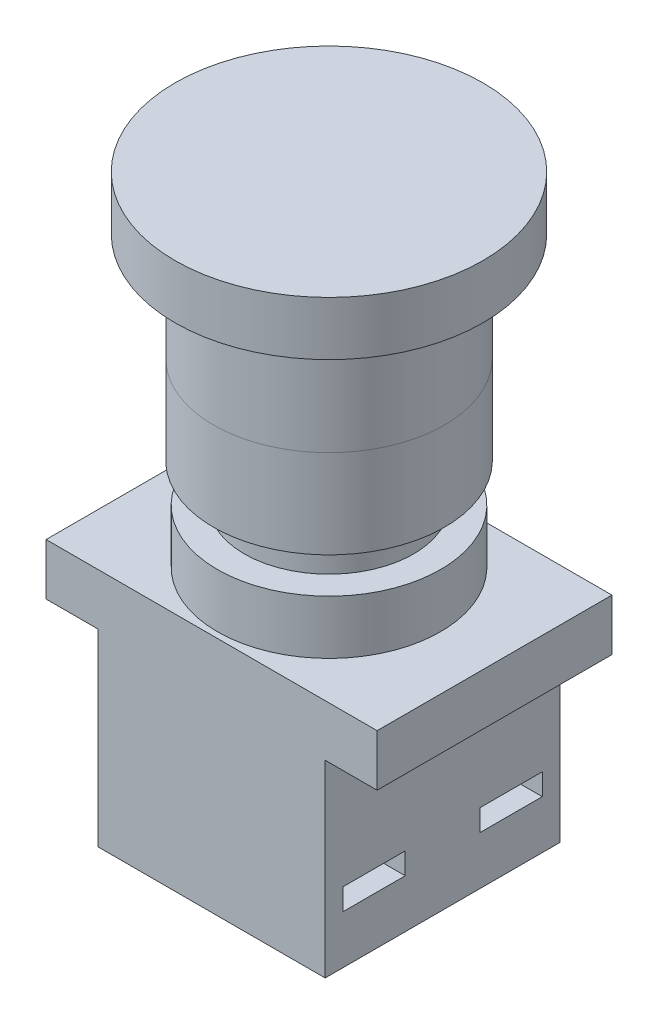
ISO-10303-21;
HEADER;
FILE_DESCRIPTION(('STEP AP214'),'2;1');
FILE_NAME('part.step','',(''),(''),'','','');
FILE_SCHEMA(('AUTOMOTIVE_DESIGN { 1 0 10303 214 1 1 1 1 }'));
ENDSEC;
DATA;
#1=APPLICATION_CONTEXT('core data for automotive mechanical design processes');
#2=APPLICATION_PROTOCOL_DEFINITION('international standard','automotive_design',2000,#1);
#3=PRODUCT_CONTEXT('',#1,'mechanical');
#4=PRODUCT('Part','Part','',(#3));
#5=PRODUCT_RELATED_PRODUCT_CATEGORY('part','',(#4));
#6=PRODUCT_DEFINITION_FORMATION('','',#4);
#7=PRODUCT_DEFINITION_CONTEXT('part definition',#1,'design');
#8=PRODUCT_DEFINITION('design','',#6,#7);
#9=PRODUCT_DEFINITION_SHAPE('','',#8);
#10=(LENGTH_UNIT() NAMED_UNIT(*) SI_UNIT(.MILLI.,.METRE.));
#11=(NAMED_UNIT(*) PLANE_ANGLE_UNIT() SI_UNIT($,.RADIAN.));
#12=(NAMED_UNIT(*) SI_UNIT($,.STERADIAN.) SOLID_ANGLE_UNIT());
#13=UNCERTAINTY_MEASURE_WITH_UNIT(LENGTH_MEASURE(1.E-05),#10,'distance_accuracy_value','');
#14=(GEOMETRIC_REPRESENTATION_CONTEXT(3) GLOBAL_UNCERTAINTY_ASSIGNED_CONTEXT((#13)) GLOBAL_UNIT_ASSIGNED_CONTEXT((#10,
#11,#12)) REPRESENTATION_CONTEXT('',''));
#15=CARTESIAN_POINT('',(0.,0.,0.));
#16=DIRECTION('',(0.,0.,1.));
#17=DIRECTION('',(1.,0.,0.));
#18=AXIS2_PLACEMENT_3D('',#15,#16,#17);
#19=CARTESIAN_POINT('',(0.,-37.5,0.));
#20=DIRECTION('',(0.,-1.,0.));
#21=DIRECTION('',(0.,0.,-1.));
#22=AXIS2_PLACEMENT_3D('',#19,#20,#21);
#23=CYLINDRICAL_SURFACE('',#22,14.5);
#24=CARTESIAN_POINT('',(0.,-37.5,0.));
#25=DIRECTION('',(0.,1.,0.));
#26=DIRECTION('',(0.,0.,1.));
#27=AXIS2_PLACEMENT_3D('',#24,#25,#26);
#28=CIRCLE('',#27,14.5);
#29=CARTESIAN_POINT('',(0.,-37.5,14.5));
#30=VERTEX_POINT('',#29);
#31=EDGE_CURVE('E11',#30,#30,#28,.T.);
#32=ORIENTED_EDGE('',*,*,#31,.F.);
#33=EDGE_LOOP('',(#32));
#34=FACE_BOUND('',#33,.T.);
#35=CARTESIAN_POINT('',(0.,-44.5,0.));
#36=DIRECTION('',(0.,1.,0.));
#37=DIRECTION('',(0.,0.,1.));
#38=AXIS2_PLACEMENT_3D('',#35,#36,#37);
#39=CIRCLE('',#38,14.5);
#40=CARTESIAN_POINT('',(0.,-44.5,14.5));
#41=VERTEX_POINT('',#40);
#42=EDGE_CURVE('E44',#41,#41,#39,.T.);
#43=ORIENTED_EDGE('',*,*,#42,.T.);
#44=EDGE_LOOP('',(#43));
#45=FACE_BOUND('',#44,.T.);
#46=ADVANCED_FACE('F41',(#34,#45),#23,.T.);
#47=CARTESIAN_POINT('',(0.,-37.5,0.));
#48=DIRECTION('',(0.,1.,0.));
#49=DIRECTION('',(0.,0.,1.));
#50=AXIS2_PLACEMENT_3D('',#47,#48,#49);
#51=PLANE('',#50);
#52=ORIENTED_EDGE('',*,*,#31,.T.);
#53=EDGE_LOOP('',(#52));
#54=FACE_BOUND('',#53,.T.);
#55=ADVANCED_FACE('F56',(#54),#51,.T.);
#56=CARTESIAN_POINT('',(0.,-44.5,0.));
#57=DIRECTION('',(0.,1.,0.));
#58=DIRECTION('',(0.,0.,1.));
#59=AXIS2_PLACEMENT_3D('',#56,#57,#58);
#60=PLANE('',#59);
#61=ORIENTED_EDGE('',*,*,#42,.F.);
#62=EDGE_LOOP('',(#61));
#63=FACE_BOUND('',#62,.T.);
#64=ADVANCED_FACE('F54',(#63),#60,.F.);
#65=CLOSED_SHELL('',(#46,#55,#64));
#66=MANIFOLD_SOLID_BREP('B2',#65);
#67=CARTESIAN_POINT('',(-14.75,-75.7,15.25));
#68=DIRECTION('',(1.,0.,0.));
#69=DIRECTION('',(0.,0.,-1.));
#70=AXIS2_PLACEMENT_3D('',#67,#68,#69);
#71=PLANE('',#70);
#72=DIRECTION('',(0.,0.,-1.));
#73=VECTOR('',#72,1.);
#74=CARTESIAN_POINT('',(-14.75,-66.6,12.95));
#75=LINE('',#74,#73);
#76=CARTESIAN_POINT('',(-14.75,-66.6,12.95));
#77=VERTEX_POINT('',#76);
#78=CARTESIAN_POINT('',(-14.75,-66.6,4.85));
#79=VERTEX_POINT('',#78);
#80=EDGE_CURVE('E361',#77,#79,#75,.T.);
#81=ORIENTED_EDGE('',*,*,#80,.F.);
#82=DIRECTION('',(0.,-1.,0.));
#83=VECTOR('',#82,1.);
#84=CARTESIAN_POINT('',(-14.75,-66.6,12.95));
#85=LINE('',#84,#83);
#86=CARTESIAN_POINT('',(-14.75,-69.4,12.95));
#87=VERTEX_POINT('',#86);
#88=EDGE_CURVE('E383',#77,#87,#85,.T.);
#89=ORIENTED_EDGE('',*,*,#88,.T.);
#90=DIRECTION('',(0.,0.,-1.));
#91=VECTOR('',#90,1.);
#92=CARTESIAN_POINT('',(-14.75,-69.4,12.95));
#93=LINE('',#92,#91);
#94=CARTESIAN_POINT('',(-14.75,-69.4,4.85));
#95=VERTEX_POINT('',#94);
#96=EDGE_CURVE('E293',#87,#95,#93,.T.);
#97=ORIENTED_EDGE('',*,*,#96,.T.);
#98=DIRECTION('',(0.,-1.,0.));
#99=VECTOR('',#98,1.);
#100=CARTESIAN_POINT('',(-14.75,-66.6,4.85));
#101=LINE('',#100,#99);
#102=EDGE_CURVE('E374',#79,#95,#101,.T.);
#103=ORIENTED_EDGE('',*,*,#102,.F.);
#104=EDGE_LOOP('',(#81,#89,#97,#103));
#105=FACE_BOUND('',#104,.T.);
#106=DIRECTION('',(0.,0.,-1.));
#107=VECTOR('',#106,1.);
#108=CARTESIAN_POINT('',(-14.75,-51.2,15.25));
#109=LINE('',#108,#107);
#110=CARTESIAN_POINT('',(-14.75,-51.2,15.25));
#111=VERTEX_POINT('',#110);
#112=CARTESIAN_POINT('',(-14.75,-51.2,-15.25));
#113=VERTEX_POINT('',#112);
#114=EDGE_CURVE('E386',#111,#113,#109,.T.);
#115=ORIENTED_EDGE('',*,*,#114,.T.);
#116=DIRECTION('',(0.,1.,0.));
#117=VECTOR('',#116,1.);
#118=CARTESIAN_POINT('',(-14.75,-75.7,-15.25));
#119=LINE('',#118,#117);
#120=CARTESIAN_POINT('',(-14.75,-75.7,-15.25));
#121=VERTEX_POINT('',#120);
#122=EDGE_CURVE('E415',#121,#113,#119,.T.);
#123=ORIENTED_EDGE('',*,*,#122,.F.);
#124=DIRECTION('',(0.,0.,-1.));
#125=VECTOR('',#124,1.);
#126=CARTESIAN_POINT('',(-14.75,-75.7,15.25));
#127=LINE('',#126,#125);
#128=CARTESIAN_POINT('',(-14.75,-75.7,15.25));
#129=VERTEX_POINT('',#128);
#130=EDGE_CURVE('E392',#129,#121,#127,.T.);
#131=ORIENTED_EDGE('',*,*,#130,.F.);
#132=DIRECTION('',(0.,1.,0.));
#133=VECTOR('',#132,1.);
#134=CARTESIAN_POINT('',(-14.75,-75.7,15.25));
#135=LINE('',#134,#133);
#136=EDGE_CURVE('E402',#129,#111,#135,.T.);
#137=ORIENTED_EDGE('',*,*,#136,.T.);
#138=EDGE_LOOP('',(#115,#123,#131,#137));
#139=FACE_BOUND('',#138,.T.);
#140=DIRECTION('',(0.,0.,-1.));
#141=VECTOR('',#140,1.);
#142=CARTESIAN_POINT('',(-14.75,-66.6,-12.95));
#143=LINE('',#142,#141);
#144=CARTESIAN_POINT('',(-14.75,-66.6,-4.85));
#145=VERTEX_POINT('',#144);
#146=CARTESIAN_POINT('',(-14.75,-66.6,-12.95));
#147=VERTEX_POINT('',#146);
#148=EDGE_CURVE('E342',#145,#147,#143,.T.);
#149=ORIENTED_EDGE('',*,*,#148,.F.);
#150=DIRECTION('',(0.,-1.,0.));
#151=VECTOR('',#150,1.);
#152=CARTESIAN_POINT('',(-14.75,-66.6,-4.85));
#153=LINE('',#152,#151);
#154=CARTESIAN_POINT('',(-14.75,-69.4,-4.85));
#155=VERTEX_POINT('',#154);
#156=EDGE_CURVE('E355',#145,#155,#153,.T.);
#157=ORIENTED_EDGE('',*,*,#156,.T.);
#158=DIRECTION('',(0.,0.,-1.));
#159=VECTOR('',#158,1.);
#160=CARTESIAN_POINT('',(-14.75,-69.4,-12.95));
#161=LINE('',#160,#159);
#162=CARTESIAN_POINT('',(-14.75,-69.4,-12.95));
#163=VERTEX_POINT('',#162);
#164=EDGE_CURVE('E336',#155,#163,#161,.T.);
#165=ORIENTED_EDGE('',*,*,#164,.T.);
#166=DIRECTION('',(0.,-1.,0.));
#167=VECTOR('',#166,1.);
#168=CARTESIAN_POINT('',(-14.75,-66.6,-12.95));
#169=LINE('',#168,#167);
#170=EDGE_CURVE('E316',#147,#163,#169,.T.);
#171=ORIENTED_EDGE('',*,*,#170,.F.);
#172=EDGE_LOOP('',(#149,#157,#165,#171));
#173=FACE_BOUND('',#172,.T.);
#174=ADVANCED_FACE('F88',(#105,#139,#173),#71,.F.);
#175=CARTESIAN_POINT('',(14.75,-75.7,15.25));
#176=DIRECTION('',(-1.,0.,0.));
#177=DIRECTION('',(0.,0.,1.));
#178=AXIS2_PLACEMENT_3D('',#175,#176,#177);
#179=PLANE('',#178);
#180=DIRECTION('',(0.,0.,1.));
#181=VECTOR('',#180,1.);
#182=CARTESIAN_POINT('',(14.75,-66.6,12.95));
#183=LINE('',#182,#181);
#184=CARTESIAN_POINT('',(14.75,-66.6,4.85));
#185=VERTEX_POINT('',#184);
#186=CARTESIAN_POINT('',(14.75,-66.6,12.95));
#187=VERTEX_POINT('',#186);
#188=EDGE_CURVE('E265',#185,#187,#183,.T.);
#189=ORIENTED_EDGE('',*,*,#188,.F.);
#190=DIRECTION('',(0.,-1.,0.));
#191=VECTOR('',#190,1.);
#192=CARTESIAN_POINT('',(14.75,-66.6,4.85));
#193=LINE('',#192,#191);
#194=CARTESIAN_POINT('',(14.75,-69.4,4.85));
#195=VERTEX_POINT('',#194);
#196=EDGE_CURVE('E294',#185,#195,#193,.T.);
#197=ORIENTED_EDGE('',*,*,#196,.T.);
#198=DIRECTION('',(0.,0.,1.));
#199=VECTOR('',#198,1.);
#200=CARTESIAN_POINT('',(14.75,-69.4,12.95));
#201=LINE('',#200,#199);
#202=CARTESIAN_POINT('',(14.75,-69.4,12.95));
#203=VERTEX_POINT('',#202);
#204=EDGE_CURVE('E278',#195,#203,#201,.T.);
#205=ORIENTED_EDGE('',*,*,#204,.T.);
#206=DIRECTION('',(0.,-1.,0.));
#207=VECTOR('',#206,1.);
#208=CARTESIAN_POINT('',(14.75,-66.6,12.95));
#209=LINE('',#208,#207);
#210=EDGE_CURVE('E291',#187,#203,#209,.T.);
#211=ORIENTED_EDGE('',*,*,#210,.F.);
#212=EDGE_LOOP('',(#189,#197,#205,#211));
#213=FACE_BOUND('',#212,.T.);
#214=DIRECTION('',(0.,0.,1.));
#215=VECTOR('',#214,1.);
#216=CARTESIAN_POINT('',(14.75,-51.2,15.25));
#217=LINE('',#216,#215);
#218=CARTESIAN_POINT('',(14.75,-51.2,-15.25));
#219=VERTEX_POINT('',#218);
#220=CARTESIAN_POINT('',(14.75,-51.2,15.25));
#221=VERTEX_POINT('',#220);
#222=EDGE_CURVE('E396',#219,#221,#217,.T.);
#223=ORIENTED_EDGE('',*,*,#222,.T.);
#224=DIRECTION('',(0.,1.,0.));
#225=VECTOR('',#224,1.);
#226=CARTESIAN_POINT('',(14.75,-75.7,15.25));
#227=LINE('',#226,#225);
#228=CARTESIAN_POINT('',(14.75,-75.7,15.25));
#229=VERTEX_POINT('',#228);
#230=EDGE_CURVE('E409',#229,#221,#227,.T.);
#231=ORIENTED_EDGE('',*,*,#230,.F.);
#232=DIRECTION('',(0.,0.,1.));
#233=VECTOR('',#232,1.);
#234=CARTESIAN_POINT('',(14.75,-75.7,15.25));
#235=LINE('',#234,#233);
#236=CARTESIAN_POINT('',(14.75,-75.7,-15.25));
#237=VERTEX_POINT('',#236);
#238=EDGE_CURVE('E398',#237,#229,#235,.T.);
#239=ORIENTED_EDGE('',*,*,#238,.F.);
#240=DIRECTION('',(0.,1.,0.));
#241=VECTOR('',#240,1.);
#242=CARTESIAN_POINT('',(14.75,-75.7,-15.25));
#243=LINE('',#242,#241);
#244=EDGE_CURVE('E412',#237,#219,#243,.T.);
#245=ORIENTED_EDGE('',*,*,#244,.T.);
#246=EDGE_LOOP('',(#223,#231,#239,#245));
#247=FACE_BOUND('',#246,.T.);
#248=DIRECTION('',(0.,0.,1.));
#249=VECTOR('',#248,1.);
#250=CARTESIAN_POINT('',(14.75,-66.6,-12.95));
#251=LINE('',#250,#249);
#252=CARTESIAN_POINT('',(14.75,-66.6,-12.95));
#253=VERTEX_POINT('',#252);
#254=CARTESIAN_POINT('',(14.75,-66.6,-4.85));
#255=VERTEX_POINT('',#254);
#256=EDGE_CURVE('E298',#253,#255,#251,.T.);
#257=ORIENTED_EDGE('',*,*,#256,.F.);
#258=DIRECTION('',(0.,-1.,0.));
#259=VECTOR('',#258,1.);
#260=CARTESIAN_POINT('',(14.75,-66.6,-12.95));
#261=LINE('',#260,#259);
#262=CARTESIAN_POINT('',(14.75,-69.4,-12.95));
#263=VERTEX_POINT('',#262);
#264=EDGE_CURVE('E288',#253,#263,#261,.T.);
#265=ORIENTED_EDGE('',*,*,#264,.T.);
#266=DIRECTION('',(0.,0.,1.));
#267=VECTOR('',#266,1.);
#268=CARTESIAN_POINT('',(14.75,-69.4,-12.95));
#269=LINE('',#268,#267);
#270=CARTESIAN_POINT('',(14.75,-69.4,-4.85));
#271=VERTEX_POINT('',#270);
#272=EDGE_CURVE('E312',#263,#271,#269,.T.);
#273=ORIENTED_EDGE('',*,*,#272,.T.);
#274=DIRECTION('',(0.,-1.,0.));
#275=VECTOR('',#274,1.);
#276=CARTESIAN_POINT('',(14.75,-66.6,-4.85));
#277=LINE('',#276,#275);
#278=EDGE_CURVE('E311',#255,#271,#277,.T.);
#279=ORIENTED_EDGE('',*,*,#278,.F.);
#280=EDGE_LOOP('',(#257,#265,#273,#279));
#281=FACE_BOUND('',#280,.T.);
#282=ADVANCED_FACE('F473',(#213,#247,#281),#179,.F.);
#283=CARTESIAN_POINT('',(0.,-51.2,0.));
#284=DIRECTION('',(0.,-1.,0.));
#285=DIRECTION('',(0.,0.,-1.));
#286=AXIS2_PLACEMENT_3D('',#283,#284,#285);
#287=PLANE('',#286);
#288=ORIENTED_EDGE('',*,*,#114,.F.);
#289=DIRECTION('',(-1.,0.,0.));
#290=VECTOR('',#289,1.);
#291=CARTESIAN_POINT('',(-21.5,-51.2,15.25));
#292=LINE('',#291,#290);
#293=CARTESIAN_POINT('',(-21.5,-51.2,15.25));
#294=VERTEX_POINT('',#293);
#295=EDGE_CURVE('E428',#111,#294,#292,.T.);
#296=ORIENTED_EDGE('',*,*,#295,.T.);
#297=DIRECTION('',(0.,0.,-1.));
#298=VECTOR('',#297,1.);
#299=CARTESIAN_POINT('',(-21.5,-51.2,15.25));
#300=LINE('',#299,#298);
#301=CARTESIAN_POINT('',(-21.5,-51.2,-15.25));
#302=VERTEX_POINT('',#301);
#303=EDGE_CURVE('E419',#294,#302,#300,.T.);
#304=ORIENTED_EDGE('',*,*,#303,.T.);
#305=DIRECTION('',(1.,0.,0.));
#306=VECTOR('',#305,1.);
#307=CARTESIAN_POINT('',(-21.5,-51.2,-15.25));
#308=LINE('',#307,#306);
#309=EDGE_CURVE('E424',#302,#113,#308,.T.);
#310=ORIENTED_EDGE('',*,*,#309,.T.);
#311=EDGE_LOOP('',(#288,#296,#304,#310));
#312=FACE_BOUND('',#311,.T.);
#313=ADVANCED_FACE('F479',(#312),#287,.T.);
#314=CARTESIAN_POINT('',(0.,-32.5,0.));
#315=DIRECTION('',(0.,1.,0.));
#316=DIRECTION('',(0.,0.,1.));
#317=AXIS2_PLACEMENT_3D('',#314,#315,#316);
#318=CYLINDRICAL_SURFACE('',#317,15.);
#319=CARTESIAN_POINT('',(0.,-32.5,0.));
#320=DIRECTION('',(0.,-1.,0.));
#321=DIRECTION('',(0.,0.,-1.));
#322=AXIS2_PLACEMENT_3D('',#319,#320,#321);
#323=CIRCLE('',#322,15.);
#324=CARTESIAN_POINT('',(0.,-32.5,-15.));
#325=VERTEX_POINT('',#324);
#326=EDGE_CURVE('E97',#325,#325,#323,.T.);
#327=ORIENTED_EDGE('',*,*,#326,.F.);
#328=EDGE_LOOP('',(#327));
#329=FACE_BOUND('',#328,.T.);
#330=CARTESIAN_POINT('',(0.,-21.,0.));
#331=DIRECTION('',(0.,-1.,0.));
#332=DIRECTION('',(0.,0.,-1.));
#333=AXIS2_PLACEMENT_3D('',#330,#331,#332);
#334=CIRCLE('',#333,15.);
#335=CARTESIAN_POINT('',(0.,-21.,-15.));
#336=VERTEX_POINT('',#335);
#337=EDGE_CURVE('E92',#336,#336,#334,.T.);
#338=ORIENTED_EDGE('',*,*,#337,.T.);
#339=EDGE_LOOP('',(#338));
#340=FACE_BOUND('',#339,.T.);
#341=ADVANCED_FACE('F90',(#329,#340),#318,.T.);
#342=CARTESIAN_POINT('',(0.,-32.5,0.));
#343=DIRECTION('',(0.,-1.,0.));
#344=DIRECTION('',(0.,0.,-1.));
#345=AXIS2_PLACEMENT_3D('',#342,#343,#344);
#346=PLANE('',#345);
#347=CARTESIAN_POINT('',(0.,-32.5,0.));
#348=DIRECTION('',(0.,-1.,0.));
#349=DIRECTION('',(0.,0.,-1.));
#350=AXIS2_PLACEMENT_3D('',#347,#348,#349);
#351=CIRCLE('',#350,11.);
#352=CARTESIAN_POINT('',(0.,-32.5,-11.));
#353=VERTEX_POINT('',#352);
#354=EDGE_CURVE('E39',#353,#353,#351,.T.);
#355=ORIENTED_EDGE('',*,*,#354,.F.);
#356=EDGE_LOOP('',(#355));
#357=FACE_BOUND('',#356,.T.);
#358=ORIENTED_EDGE('',*,*,#326,.T.);
#359=EDGE_LOOP('',(#358));
#360=FACE_BOUND('',#359,.T.);
#361=ADVANCED_FACE('F462',(#357,#360),#346,.T.);
#362=CARTESIAN_POINT('',(0.,-21.,0.));
#363=DIRECTION('',(0.,-1.,0.));
#364=DIRECTION('',(0.,0.,-1.));
#365=AXIS2_PLACEMENT_3D('',#362,#363,#364);
#366=PLANE('',#365);
#367=ORIENTED_EDGE('',*,*,#337,.F.);
#368=EDGE_LOOP('',(#367));
#369=FACE_BOUND('',#368,.T.);
#370=ADVANCED_FACE('F459',(#369),#366,.F.);
#371=CARTESIAN_POINT('',(0.,-44.5,0.));
#372=DIRECTION('',(0.,1.,0.));
#373=DIRECTION('',(0.,0.,1.));
#374=AXIS2_PLACEMENT_3D('',#371,#372,#373);
#375=CYLINDRICAL_SURFACE('',#374,11.);
#376=CARTESIAN_POINT('',(0.,-44.5,0.));
#377=DIRECTION('',(0.,-1.,0.));
#378=DIRECTION('',(0.,0.,-1.));
#379=AXIS2_PLACEMENT_3D('',#376,#377,#378);
#380=CIRCLE('',#379,11.);
#381=CARTESIAN_POINT('',(0.,-44.5,-11.));
#382=VERTEX_POINT('',#381);
#383=EDGE_CURVE('E450',#382,#382,#380,.T.);
#384=ORIENTED_EDGE('',*,*,#383,.F.);
#385=EDGE_LOOP('',(#384));
#386=FACE_BOUND('',#385,.T.);
#387=ORIENTED_EDGE('',*,*,#354,.T.);
#388=EDGE_LOOP('',(#387));
#389=FACE_BOUND('',#388,.T.);
#390=ADVANCED_FACE('F461',(#386,#389),#375,.T.);
#391=CARTESIAN_POINT('',(-21.5,-51.2,15.25));
#392=DIRECTION('',(1.,0.,0.));
#393=DIRECTION('',(0.,0.,-1.));
#394=AXIS2_PLACEMENT_3D('',#391,#392,#393);
#395=PLANE('',#394);
#396=DIRECTION('',(0.,0.,-1.));
#397=VECTOR('',#396,1.);
#398=CARTESIAN_POINT('',(-21.5,-44.5,15.25));
#399=LINE('',#398,#397);
#400=CARTESIAN_POINT('',(-21.5,-44.5,15.25));
#401=VERTEX_POINT('',#400);
#402=CARTESIAN_POINT('',(-21.5,-44.5,-15.25));
#403=VERTEX_POINT('',#402);
#404=EDGE_CURVE('E418',#401,#403,#399,.T.);
#405=ORIENTED_EDGE('',*,*,#404,.T.);
#406=DIRECTION('',(0.,1.,0.));
#407=VECTOR('',#406,1.);
#408=CARTESIAN_POINT('',(-21.5,-51.2,-15.25));
#409=LINE('',#408,#407);
#410=EDGE_CURVE('E447',#302,#403,#409,.T.);
#411=ORIENTED_EDGE('',*,*,#410,.F.);
#412=ORIENTED_EDGE('',*,*,#303,.F.);
#413=DIRECTION('',(0.,1.,0.));
#414=VECTOR('',#413,1.);
#415=CARTESIAN_POINT('',(-21.5,-51.2,15.25));
#416=LINE('',#415,#414);
#417=EDGE_CURVE('E431',#294,#401,#416,.T.);
#418=ORIENTED_EDGE('',*,*,#417,.T.);
#419=EDGE_LOOP('',(#405,#411,#412,#418));
#420=FACE_BOUND('',#419,.T.);
#421=ADVANCED_FACE('F467',(#420),#395,.F.);
#422=CARTESIAN_POINT('',(-21.5,-51.2,-15.25));
#423=DIRECTION('',(0.,0.,1.));
#424=DIRECTION('',(1.,0.,0.));
#425=AXIS2_PLACEMENT_3D('',#422,#423,#424);
#426=PLANE('',#425);
#427=DIRECTION('',(1.,0.,0.));
#428=VECTOR('',#427,1.);
#429=CARTESIAN_POINT('',(-21.5,-44.5,-15.25));
#430=LINE('',#429,#428);
#431=CARTESIAN_POINT('',(21.5,-44.5,-15.25));
#432=VERTEX_POINT('',#431);
#433=EDGE_CURVE('E434',#403,#432,#430,.T.);
#434=ORIENTED_EDGE('',*,*,#433,.T.);
#435=DIRECTION('',(0.,1.,0.));
#436=VECTOR('',#435,1.);
#437=CARTESIAN_POINT('',(21.5,-51.2,-15.25));
#438=LINE('',#437,#436);
#439=CARTESIAN_POINT('',(21.5,-51.2,-15.25));
#440=VERTEX_POINT('',#439);
#441=EDGE_CURVE('E444',#440,#432,#438,.T.);
#442=ORIENTED_EDGE('',*,*,#441,.F.);
#443=EDGE_CURVE('E422',#219,#440,#308,.T.);
#444=ORIENTED_EDGE('',*,*,#443,.F.);
#445=ORIENTED_EDGE('',*,*,#244,.F.);
#446=DIRECTION('',(1.,0.,0.));
#447=VECTOR('',#446,1.);
#448=CARTESIAN_POINT('',(-14.75,-75.7,-15.25));
#449=LINE('',#448,#447);
#450=EDGE_CURVE('E395',#121,#237,#449,.T.);
#451=ORIENTED_EDGE('',*,*,#450,.F.);
#452=ORIENTED_EDGE('',*,*,#122,.T.);
#453=ORIENTED_EDGE('',*,*,#309,.F.);
#454=ORIENTED_EDGE('',*,*,#410,.T.);
#455=EDGE_LOOP('',(#434,#442,#444,#445,#451,#452,#453,#454));
#456=FACE_BOUND('',#455,.T.);
#457=ADVANCED_FACE('F502',(#456),#426,.F.);
#458=CARTESIAN_POINT('',(21.5,-51.2,15.25));
#459=DIRECTION('',(-1.,0.,0.));
#460=DIRECTION('',(0.,0.,1.));
#461=AXIS2_PLACEMENT_3D('',#458,#459,#460);
#462=PLANE('',#461);
#463=DIRECTION('',(0.,0.,1.));
#464=VECTOR('',#463,1.);
#465=CARTESIAN_POINT('',(21.5,-44.5,15.25));
#466=LINE('',#465,#464);
#467=CARTESIAN_POINT('',(21.5,-44.5,15.25));
#468=VERTEX_POINT('',#467);
#469=EDGE_CURVE('E436',#432,#468,#466,.T.);
#470=ORIENTED_EDGE('',*,*,#469,.T.);
#471=DIRECTION('',(0.,1.,0.));
#472=VECTOR('',#471,1.);
#473=CARTESIAN_POINT('',(21.5,-51.2,15.25));
#474=LINE('',#473,#472);
#475=CARTESIAN_POINT('',(21.5,-51.2,15.25));
#476=VERTEX_POINT('',#475);
#477=EDGE_CURVE('E441',#476,#468,#474,.T.);
#478=ORIENTED_EDGE('',*,*,#477,.F.);
#479=DIRECTION('',(0.,0.,1.));
#480=VECTOR('',#479,1.);
#481=CARTESIAN_POINT('',(21.5,-51.2,15.25));
#482=LINE('',#481,#480);
#483=EDGE_CURVE('E426',#440,#476,#482,.T.);
#484=ORIENTED_EDGE('',*,*,#483,.F.);
#485=ORIENTED_EDGE('',*,*,#441,.T.);
#486=EDGE_LOOP('',(#470,#478,#484,#485));
#487=FACE_BOUND('',#486,.T.);
#488=ADVANCED_FACE('F498',(#487),#462,.F.);
#489=CARTESIAN_POINT('',(-21.5,-51.2,15.25));
#490=DIRECTION('',(0.,0.,-1.));
#491=DIRECTION('',(-1.,0.,0.));
#492=AXIS2_PLACEMENT_3D('',#489,#490,#491);
#493=PLANE('',#492);
#494=DIRECTION('',(-1.,0.,0.));
#495=VECTOR('',#494,1.);
#496=CARTESIAN_POINT('',(-21.5,-44.5,15.25));
#497=LINE('',#496,#495);
#498=EDGE_CURVE('E423',#468,#401,#497,.T.);
#499=ORIENTED_EDGE('',*,*,#498,.T.);
#500=ORIENTED_EDGE('',*,*,#417,.F.);
#501=ORIENTED_EDGE('',*,*,#295,.F.);
#502=ORIENTED_EDGE('',*,*,#136,.F.);
#503=DIRECTION('',(-1.,0.,0.));
#504=VECTOR('',#503,1.);
#505=CARTESIAN_POINT('',(-14.75,-75.7,15.25));
#506=LINE('',#505,#504);
#507=EDGE_CURVE('E400',#229,#129,#506,.T.);
#508=ORIENTED_EDGE('',*,*,#507,.F.);
#509=ORIENTED_EDGE('',*,*,#230,.T.);
#510=EDGE_CURVE('E429',#476,#221,#292,.T.);
#511=ORIENTED_EDGE('',*,*,#510,.F.);
#512=ORIENTED_EDGE('',*,*,#477,.T.);
#513=EDGE_LOOP('',(#499,#500,#501,#502,#508,#509,#511,#512));
#514=FACE_BOUND('',#513,.T.);
#515=ADVANCED_FACE('F490',(#514),#493,.F.);
#516=ORIENTED_EDGE('',*,*,#222,.F.);
#517=ORIENTED_EDGE('',*,*,#443,.T.);
#518=ORIENTED_EDGE('',*,*,#483,.T.);
#519=ORIENTED_EDGE('',*,*,#510,.T.);
#520=EDGE_LOOP('',(#516,#517,#518,#519));
#521=FACE_BOUND('',#520,.T.);
#522=ADVANCED_FACE('F486',(#521),#287,.T.);
#523=CARTESIAN_POINT('',(0.,-44.5,0.));
#524=DIRECTION('',(0.,-1.,0.));
#525=DIRECTION('',(0.,0.,-1.));
#526=AXIS2_PLACEMENT_3D('',#523,#524,#525);
#527=PLANE('',#526);
#528=ORIENTED_EDGE('',*,*,#383,.T.);
#529=EDGE_LOOP('',(#528));
#530=FACE_BOUND('',#529,.T.);
#531=ORIENTED_EDGE('',*,*,#404,.F.);
#532=ORIENTED_EDGE('',*,*,#498,.F.);
#533=ORIENTED_EDGE('',*,*,#469,.F.);
#534=ORIENTED_EDGE('',*,*,#433,.F.);
#535=EDGE_LOOP('',(#531,#532,#533,#534));
#536=FACE_BOUND('',#535,.T.);
#537=ADVANCED_FACE('F489',(#530,#536),#527,.F.);
#538=CARTESIAN_POINT('',(0.,-75.7,0.));
#539=DIRECTION('',(0.,-1.,0.));
#540=DIRECTION('',(0.,0.,-1.));
#541=AXIS2_PLACEMENT_3D('',#538,#539,#540);
#542=PLANE('',#541);
#543=ORIENTED_EDGE('',*,*,#130,.T.);
#544=ORIENTED_EDGE('',*,*,#450,.T.);
#545=ORIENTED_EDGE('',*,*,#238,.T.);
#546=ORIENTED_EDGE('',*,*,#507,.T.);
#547=EDGE_LOOP('',(#543,#544,#545,#546));
#548=FACE_BOUND('',#547,.T.);
#549=ADVANCED_FACE('F494',(#548),#542,.T.);
#550=CARTESIAN_POINT('',(14.75,-66.6,12.95));
#551=DIRECTION('',(0.,0.,1.));
#552=DIRECTION('',(1.,0.,0.));
#553=AXIS2_PLACEMENT_3D('',#550,#551,#552);
#554=PLANE('',#553);
#555=DIRECTION('',(-1.,0.,0.));
#556=VECTOR('',#555,1.);
#557=CARTESIAN_POINT('',(14.75,-69.4,12.95));
#558=LINE('',#557,#556);
#559=CARTESIAN_POINT('',(4.75,-69.4,12.95));
#560=VERTEX_POINT('',#559);
#561=EDGE_CURVE('E260',#203,#560,#558,.T.);
#562=ORIENTED_EDGE('',*,*,#561,.T.);
#563=DIRECTION('',(0.,-1.,0.));
#564=VECTOR('',#563,1.);
#565=CARTESIAN_POINT('',(4.75,-66.6,12.95));
#566=LINE('',#565,#564);
#567=CARTESIAN_POINT('',(4.75,-66.6,12.95));
#568=VERTEX_POINT('',#567);
#569=EDGE_CURVE('E253',#568,#560,#566,.T.);
#570=ORIENTED_EDGE('',*,*,#569,.F.);
#571=DIRECTION('',(-1.,0.,0.));
#572=VECTOR('',#571,1.);
#573=CARTESIAN_POINT('',(14.75,-66.6,12.95));
#574=LINE('',#573,#572);
#575=EDGE_CURVE('E258',#187,#568,#574,.T.);
#576=ORIENTED_EDGE('',*,*,#575,.F.);
#577=ORIENTED_EDGE('',*,*,#210,.T.);
#578=EDGE_LOOP('',(#562,#570,#576,#577));
#579=FACE_BOUND('',#578,.T.);
#580=ADVANCED_FACE('F255',(#579),#554,.F.);
#581=CARTESIAN_POINT('',(14.75,-66.6,4.85));
#582=DIRECTION('',(0.,0.,-1.));
#583=DIRECTION('',(-1.,0.,0.));
#584=AXIS2_PLACEMENT_3D('',#581,#582,#583);
#585=PLANE('',#584);
#586=DIRECTION('',(1.,0.,0.));
#587=VECTOR('',#586,1.);
#588=CARTESIAN_POINT('',(14.75,-69.4,4.85));
#589=LINE('',#588,#587);
#590=CARTESIAN_POINT('',(4.75,-69.4,4.84999999999999));
#591=VERTEX_POINT('',#590);
#592=EDGE_CURVE('E281',#591,#195,#589,.T.);
#593=ORIENTED_EDGE('',*,*,#592,.T.);
#594=ORIENTED_EDGE('',*,*,#196,.F.);
#595=DIRECTION('',(1.,0.,0.));
#596=VECTOR('',#595,1.);
#597=CARTESIAN_POINT('',(14.75,-66.6,4.85));
#598=LINE('',#597,#596);
#599=CARTESIAN_POINT('',(4.75,-66.6,4.84999999999999));
#600=VERTEX_POINT('',#599);
#601=EDGE_CURVE('E273',#600,#185,#598,.T.);
#602=ORIENTED_EDGE('',*,*,#601,.F.);
#603=DIRECTION('',(0.,-1.,0.));
#604=VECTOR('',#603,1.);
#605=CARTESIAN_POINT('',(4.75,-66.6,4.84999999999999));
#606=LINE('',#605,#604);
#607=EDGE_CURVE('E264',#600,#591,#606,.T.);
#608=ORIENTED_EDGE('',*,*,#607,.T.);
#609=EDGE_LOOP('',(#593,#594,#602,#608));
#610=FACE_BOUND('',#609,.T.);
#611=ADVANCED_FACE('F587',(#610),#585,.F.);
#612=CARTESIAN_POINT('',(4.75,-66.6,12.95));
#613=DIRECTION('',(-1.,0.,0.));
#614=DIRECTION('',(0.,0.,1.));
#615=AXIS2_PLACEMENT_3D('',#612,#613,#614);
#616=PLANE('',#615);
#617=DIRECTION('',(0.,0.,-1.));
#618=VECTOR('',#617,1.);
#619=CARTESIAN_POINT('',(4.75,-69.4,12.95));
#620=LINE('',#619,#618);
#621=EDGE_CURVE('E287',#560,#591,#620,.T.);
#622=ORIENTED_EDGE('',*,*,#621,.T.);
#623=ORIENTED_EDGE('',*,*,#607,.F.);
#624=DIRECTION('',(0.,0.,-1.));
#625=VECTOR('',#624,1.);
#626=CARTESIAN_POINT('',(4.75,-66.6,12.95));
#627=LINE('',#626,#625);
#628=EDGE_CURVE('E268',#568,#600,#627,.T.);
#629=ORIENTED_EDGE('',*,*,#628,.F.);
#630=ORIENTED_EDGE('',*,*,#569,.T.);
#631=EDGE_LOOP('',(#622,#623,#629,#630));
#632=FACE_BOUND('',#631,.T.);
#633=ADVANCED_FACE('F269',(#632),#616,.F.);
#634=CARTESIAN_POINT('',(0.,-66.6,0.));
#635=DIRECTION('',(0.,-1.,0.));
#636=DIRECTION('',(0.,0.,-1.));
#637=AXIS2_PLACEMENT_3D('',#634,#635,#636);
#638=PLANE('',#637);
#639=ORIENTED_EDGE('',*,*,#575,.T.);
#640=ORIENTED_EDGE('',*,*,#628,.T.);
#641=ORIENTED_EDGE('',*,*,#601,.T.);
#642=ORIENTED_EDGE('',*,*,#188,.T.);
#643=EDGE_LOOP('',(#639,#640,#641,#642));
#644=FACE_BOUND('',#643,.T.);
#645=ADVANCED_FACE('F275',(#644),#638,.T.);
#646=CARTESIAN_POINT('',(0.,-69.4,0.));
#647=DIRECTION('',(0.,-1.,0.));
#648=DIRECTION('',(0.,0.,-1.));
#649=AXIS2_PLACEMENT_3D('',#646,#647,#648);
#650=PLANE('',#649);
#651=ORIENTED_EDGE('',*,*,#561,.F.);
#652=ORIENTED_EDGE('',*,*,#204,.F.);
#653=ORIENTED_EDGE('',*,*,#592,.F.);
#654=ORIENTED_EDGE('',*,*,#621,.F.);
#655=EDGE_LOOP('',(#651,#652,#653,#654));
#656=FACE_BOUND('',#655,.T.);
#657=ADVANCED_FACE('F608',(#656),#650,.F.);
#658=CARTESIAN_POINT('',(14.75,-66.6,-12.95));
#659=DIRECTION('',(0.,0.,-1.));
#660=DIRECTION('',(-1.,0.,0.));
#661=AXIS2_PLACEMENT_3D('',#658,#659,#660);
#662=PLANE('',#661);
#663=DIRECTION('',(1.,0.,0.));
#664=VECTOR('',#663,1.);
#665=CARTESIAN_POINT('',(14.75,-69.4,-12.95));
#666=LINE('',#665,#664);
#667=CARTESIAN_POINT('',(4.75,-69.4,-12.95));
#668=VERTEX_POINT('',#667);
#669=EDGE_CURVE('E302',#668,#263,#666,.T.);
#670=ORIENTED_EDGE('',*,*,#669,.T.);
#671=ORIENTED_EDGE('',*,*,#264,.F.);
#672=DIRECTION('',(1.,0.,0.));
#673=VECTOR('',#672,1.);
#674=CARTESIAN_POINT('',(14.75,-66.6,-12.95));
#675=LINE('',#674,#673);
#676=CARTESIAN_POINT('',(4.75,-66.6,-12.95));
#677=VERTEX_POINT('',#676);
#678=EDGE_CURVE('E308',#677,#253,#675,.T.);
#679=ORIENTED_EDGE('',*,*,#678,.F.);
#680=DIRECTION('',(0.,-1.,0.));
#681=VECTOR('',#680,1.);
#682=CARTESIAN_POINT('',(4.75,-66.6,-12.95));
#683=LINE('',#682,#681);
#684=EDGE_CURVE('E326',#677,#668,#683,.T.);
#685=ORIENTED_EDGE('',*,*,#684,.T.);
#686=EDGE_LOOP('',(#670,#671,#679,#685));
#687=FACE_BOUND('',#686,.T.);
#688=ADVANCED_FACE('F604',(#687),#662,.F.);
#689=CARTESIAN_POINT('',(4.75,-66.6,-12.95));
#690=DIRECTION('',(-1.,0.,0.));
#691=DIRECTION('',(0.,0.,1.));
#692=AXIS2_PLACEMENT_3D('',#689,#690,#691);
#693=PLANE('',#692);
#694=DIRECTION('',(0.,0.,-1.));
#695=VECTOR('',#694,1.);
#696=CARTESIAN_POINT('',(4.75,-69.4,-12.95));
#697=LINE('',#696,#695);
#698=CARTESIAN_POINT('',(4.75,-69.4,-4.84999999999999));
#699=VERTEX_POINT('',#698);
#700=EDGE_CURVE('E319',#699,#668,#697,.T.);
#701=ORIENTED_EDGE('',*,*,#700,.T.);
#702=ORIENTED_EDGE('',*,*,#684,.F.);
#703=DIRECTION('',(0.,0.,-1.));
#704=VECTOR('',#703,1.);
#705=CARTESIAN_POINT('',(4.75,-66.6,-12.95));
#706=LINE('',#705,#704);
#707=CARTESIAN_POINT('',(4.75,-66.6,-4.84999999999999));
#708=VERTEX_POINT('',#707);
#709=EDGE_CURVE('E305',#708,#677,#706,.T.);
#710=ORIENTED_EDGE('',*,*,#709,.F.);
#711=DIRECTION('',(0.,-1.,0.));
#712=VECTOR('',#711,1.);
#713=CARTESIAN_POINT('',(4.75,-66.6,-4.84999999999999));
#714=LINE('',#713,#712);
#715=EDGE_CURVE('E328',#708,#699,#714,.T.);
#716=ORIENTED_EDGE('',*,*,#715,.T.);
#717=EDGE_LOOP('',(#701,#702,#710,#716));
#718=FACE_BOUND('',#717,.T.);
#719=ADVANCED_FACE('F607',(#718),#693,.F.);
#720=CARTESIAN_POINT('',(14.75,-66.6,-4.85));
#721=DIRECTION('',(0.,0.,1.));
#722=DIRECTION('',(1.,0.,0.));
#723=AXIS2_PLACEMENT_3D('',#720,#721,#722);
#724=PLANE('',#723);
#725=DIRECTION('',(-1.,0.,0.));
#726=VECTOR('',#725,1.);
#727=CARTESIAN_POINT('',(14.75,-69.4,-4.85));
#728=LINE('',#727,#726);
#729=EDGE_CURVE('E315',#271,#699,#728,.T.);
#730=ORIENTED_EDGE('',*,*,#729,.T.);
#731=ORIENTED_EDGE('',*,*,#715,.F.);
#732=DIRECTION('',(-1.,0.,0.));
#733=VECTOR('',#732,1.);
#734=CARTESIAN_POINT('',(14.75,-66.6,-4.85));
#735=LINE('',#734,#733);
#736=EDGE_CURVE('E301',#255,#708,#735,.T.);
#737=ORIENTED_EDGE('',*,*,#736,.F.);
#738=ORIENTED_EDGE('',*,*,#278,.T.);
#739=EDGE_LOOP('',(#730,#731,#737,#738));
#740=FACE_BOUND('',#739,.T.);
#741=ADVANCED_FACE('F599',(#740),#724,.F.);
#742=CARTESIAN_POINT('',(0.,-66.6,0.));
#743=DIRECTION('',(0.,-1.,0.));
#744=DIRECTION('',(0.,0.,-1.));
#745=AXIS2_PLACEMENT_3D('',#742,#743,#744);
#746=PLANE('',#745);
#747=ORIENTED_EDGE('',*,*,#256,.T.);
#748=ORIENTED_EDGE('',*,*,#736,.T.);
#749=ORIENTED_EDGE('',*,*,#709,.T.);
#750=ORIENTED_EDGE('',*,*,#678,.T.);
#751=EDGE_LOOP('',(#747,#748,#749,#750));
#752=FACE_BOUND('',#751,.T.);
#753=ADVANCED_FACE('F596',(#752),#746,.T.);
#754=CARTESIAN_POINT('',(0.,-69.4,0.));
#755=DIRECTION('',(0.,-1.,0.));
#756=DIRECTION('',(0.,0.,-1.));
#757=AXIS2_PLACEMENT_3D('',#754,#755,#756);
#758=PLANE('',#757);
#759=ORIENTED_EDGE('',*,*,#272,.F.);
#760=ORIENTED_EDGE('',*,*,#669,.F.);
#761=ORIENTED_EDGE('',*,*,#700,.F.);
#762=ORIENTED_EDGE('',*,*,#729,.F.);
#763=EDGE_LOOP('',(#759,#760,#761,#762));
#764=FACE_BOUND('',#763,.T.);
#765=ADVANCED_FACE('F576',(#764),#758,.F.);
#766=CARTESIAN_POINT('',(-14.75,-66.6,12.95));
#767=DIRECTION('',(0.,0.,1.));
#768=DIRECTION('',(1.,0.,0.));
#769=AXIS2_PLACEMENT_3D('',#766,#767,#768);
#770=PLANE('',#769);
#771=DIRECTION('',(-1.,0.,0.));
#772=VECTOR('',#771,1.);
#773=CARTESIAN_POINT('',(-14.75,-69.4,12.95));
#774=LINE('',#773,#772);
#775=CARTESIAN_POINT('',(-4.75,-69.4,12.95));
#776=VERTEX_POINT('',#775);
#777=EDGE_CURVE('E365',#776,#87,#774,.T.);
#778=ORIENTED_EDGE('',*,*,#777,.T.);
#779=ORIENTED_EDGE('',*,*,#88,.F.);
#780=DIRECTION('',(-1.,0.,0.));
#781=VECTOR('',#780,1.);
#782=CARTESIAN_POINT('',(-14.75,-66.6,12.95));
#783=LINE('',#782,#781);
#784=CARTESIAN_POINT('',(-4.75,-66.6,12.95));
#785=VERTEX_POINT('',#784);
#786=EDGE_CURVE('E371',#785,#77,#783,.T.);
#787=ORIENTED_EDGE('',*,*,#786,.F.);
#788=DIRECTION('',(0.,-1.,0.));
#789=VECTOR('',#788,1.);
#790=CARTESIAN_POINT('',(-4.75,-66.6,12.95));
#791=LINE('',#790,#789);
#792=EDGE_CURVE('E387',#785,#776,#791,.T.);
#793=ORIENTED_EDGE('',*,*,#792,.T.);
#794=EDGE_LOOP('',(#778,#779,#787,#793));
#795=FACE_BOUND('',#794,.T.);
#796=ADVANCED_FACE('F572',(#795),#770,.F.);
#797=CARTESIAN_POINT('',(-4.75,-66.6,12.95));
#798=DIRECTION('',(1.,0.,0.));
#799=DIRECTION('',(0.,0.,-1.));
#800=AXIS2_PLACEMENT_3D('',#797,#798,#799);
#801=PLANE('',#800);
#802=DIRECTION('',(0.,0.,1.));
#803=VECTOR('',#802,1.);
#804=CARTESIAN_POINT('',(-4.75,-69.4,12.95));
#805=LINE('',#804,#803);
#806=CARTESIAN_POINT('',(-4.75,-69.4,4.84999999999999));
#807=VERTEX_POINT('',#806);
#808=EDGE_CURVE('E378',#807,#776,#805,.T.);
#809=ORIENTED_EDGE('',*,*,#808,.T.);
#810=ORIENTED_EDGE('',*,*,#792,.F.);
#811=DIRECTION('',(0.,0.,1.));
#812=VECTOR('',#811,1.);
#813=CARTESIAN_POINT('',(-4.75,-66.6,12.95));
#814=LINE('',#813,#812);
#815=CARTESIAN_POINT('',(-4.75,-66.6,4.84999999999999));
#816=VERTEX_POINT('',#815);
#817=EDGE_CURVE('E368',#816,#785,#814,.T.);
#818=ORIENTED_EDGE('',*,*,#817,.F.);
#819=DIRECTION('',(0.,-1.,0.));
#820=VECTOR('',#819,1.);
#821=CARTESIAN_POINT('',(-4.75,-66.6,4.84999999999999));
#822=LINE('',#821,#820);
#823=EDGE_CURVE('E389',#816,#807,#822,.T.);
#824=ORIENTED_EDGE('',*,*,#823,.T.);
#825=EDGE_LOOP('',(#809,#810,#818,#824));
#826=FACE_BOUND('',#825,.T.);
#827=ADVANCED_FACE('F575',(#826),#801,.F.);
#828=CARTESIAN_POINT('',(-14.75,-66.6,4.85));
#829=DIRECTION('',(0.,0.,-1.));
#830=DIRECTION('',(-1.,0.,0.));
#831=AXIS2_PLACEMENT_3D('',#828,#829,#830);
#832=PLANE('',#831);
#833=DIRECTION('',(1.,0.,0.));
#834=VECTOR('',#833,1.);
#835=CARTESIAN_POINT('',(-14.75,-69.4,4.85));
#836=LINE('',#835,#834);
#837=EDGE_CURVE('E113',#95,#807,#836,.T.);
#838=ORIENTED_EDGE('',*,*,#837,.T.);
#839=ORIENTED_EDGE('',*,*,#823,.F.);
#840=DIRECTION('',(1.,0.,0.));
#841=VECTOR('',#840,1.);
#842=CARTESIAN_POINT('',(-14.75,-66.6,4.85));
#843=LINE('',#842,#841);
#844=EDGE_CURVE('E364',#79,#816,#843,.T.);
#845=ORIENTED_EDGE('',*,*,#844,.F.);
#846=ORIENTED_EDGE('',*,*,#102,.T.);
#847=EDGE_LOOP('',(#838,#839,#845,#846));
#848=FACE_BOUND('',#847,.T.);
#849=ADVANCED_FACE('F568',(#848),#832,.F.);
#850=CARTESIAN_POINT('',(0.,-66.6,0.));
#851=DIRECTION('',(0.,-1.,0.));
#852=DIRECTION('',(0.,0.,-1.));
#853=AXIS2_PLACEMENT_3D('',#850,#851,#852);
#854=PLANE('',#853);
#855=ORIENTED_EDGE('',*,*,#80,.T.);
#856=ORIENTED_EDGE('',*,*,#844,.T.);
#857=ORIENTED_EDGE('',*,*,#817,.T.);
#858=ORIENTED_EDGE('',*,*,#786,.T.);
#859=EDGE_LOOP('',(#855,#856,#857,#858));
#860=FACE_BOUND('',#859,.T.);
#861=ADVANCED_FACE('F565',(#860),#854,.T.);
#862=CARTESIAN_POINT('',(0.,-69.4,0.));
#863=DIRECTION('',(0.,-1.,0.));
#864=DIRECTION('',(0.,0.,-1.));
#865=AXIS2_PLACEMENT_3D('',#862,#863,#864);
#866=PLANE('',#865);
#867=ORIENTED_EDGE('',*,*,#96,.F.);
#868=ORIENTED_EDGE('',*,*,#777,.F.);
#869=ORIENTED_EDGE('',*,*,#808,.F.);
#870=ORIENTED_EDGE('',*,*,#837,.F.);
#871=EDGE_LOOP('',(#867,#868,#869,#870));
#872=FACE_BOUND('',#871,.T.);
#873=ADVANCED_FACE('F563',(#872),#866,.F.);
#874=CARTESIAN_POINT('',(-14.75,-66.6,-12.95));
#875=DIRECTION('',(0.,0.,-1.));
#876=DIRECTION('',(-1.,0.,0.));
#877=AXIS2_PLACEMENT_3D('',#874,#875,#876);
#878=PLANE('',#877);
#879=DIRECTION('',(1.,0.,0.));
#880=VECTOR('',#879,1.);
#881=CARTESIAN_POINT('',(-14.75,-69.4,-12.95));
#882=LINE('',#881,#880);
#883=CARTESIAN_POINT('',(-4.75,-69.4,-12.95));
#884=VERTEX_POINT('',#883);
#885=EDGE_CURVE('E105',#163,#884,#882,.T.);
#886=ORIENTED_EDGE('',*,*,#885,.T.);
#887=DIRECTION('',(0.,-1.,0.));
#888=VECTOR('',#887,1.);
#889=CARTESIAN_POINT('',(-4.75,-66.6,-12.95));
#890=LINE('',#889,#888);
#891=CARTESIAN_POINT('',(-4.75,-66.6,-12.95));
#892=VERTEX_POINT('',#891);
#893=EDGE_CURVE('E345',#892,#884,#890,.T.);
#894=ORIENTED_EDGE('',*,*,#893,.F.);
#895=DIRECTION('',(1.,0.,0.));
#896=VECTOR('',#895,1.);
#897=CARTESIAN_POINT('',(-14.75,-66.6,-12.95));
#898=LINE('',#897,#896);
#899=EDGE_CURVE('E332',#147,#892,#898,.T.);
#900=ORIENTED_EDGE('',*,*,#899,.F.);
#901=ORIENTED_EDGE('',*,*,#170,.T.);
#902=EDGE_LOOP('',(#886,#894,#900,#901));
#903=FACE_BOUND('',#902,.T.);
#904=ADVANCED_FACE('F557',(#903),#878,.F.);
#905=CARTESIAN_POINT('',(-14.75,-66.6,-4.85));
#906=DIRECTION('',(0.,0.,1.));
#907=DIRECTION('',(1.,0.,0.));
#908=AXIS2_PLACEMENT_3D('',#905,#906,#907);
#909=PLANE('',#908);
#910=DIRECTION('',(-1.,0.,0.));
#911=VECTOR('',#910,1.);
#912=CARTESIAN_POINT('',(-14.75,-69.4,-4.85));
#913=LINE('',#912,#911);
#914=CARTESIAN_POINT('',(-4.75,-69.4,-4.84999999999999));
#915=VERTEX_POINT('',#914);
#916=EDGE_CURVE('E350',#915,#155,#913,.T.);
#917=ORIENTED_EDGE('',*,*,#916,.T.);
#918=ORIENTED_EDGE('',*,*,#156,.F.);
#919=DIRECTION('',(-1.,0.,0.));
#920=VECTOR('',#919,1.);
#921=CARTESIAN_POINT('',(-14.75,-66.6,-4.85));
#922=LINE('',#921,#920);
#923=CARTESIAN_POINT('',(-4.75,-66.6,-4.84999999999999));
#924=VERTEX_POINT('',#923);
#925=EDGE_CURVE('E339',#924,#145,#922,.T.);
#926=ORIENTED_EDGE('',*,*,#925,.F.);
#927=DIRECTION('',(0.,-1.,0.));
#928=VECTOR('',#927,1.);
#929=CARTESIAN_POINT('',(-4.75,-66.6,-4.84999999999999));
#930=LINE('',#929,#928);
#931=EDGE_CURVE('E358',#924,#915,#930,.T.);
#932=ORIENTED_EDGE('',*,*,#931,.T.);
#933=EDGE_LOOP('',(#917,#918,#926,#932));
#934=FACE_BOUND('',#933,.T.);
#935=ADVANCED_FACE('F543',(#934),#909,.F.);
#936=CARTESIAN_POINT('',(-4.75,-66.6,-12.95));
#937=DIRECTION('',(1.,0.,0.));
#938=DIRECTION('',(0.,0.,-1.));
#939=AXIS2_PLACEMENT_3D('',#936,#937,#938);
#940=PLANE('',#939);
#941=DIRECTION('',(0.,0.,1.));
#942=VECTOR('',#941,1.);
#943=CARTESIAN_POINT('',(-4.75,-69.4,-12.95));
#944=LINE('',#943,#942);
#945=EDGE_CURVE('E347',#884,#915,#944,.T.);
#946=ORIENTED_EDGE('',*,*,#945,.T.);
#947=ORIENTED_EDGE('',*,*,#931,.F.);
#948=DIRECTION('',(0.,0.,1.));
#949=VECTOR('',#948,1.);
#950=CARTESIAN_POINT('',(-4.75,-66.6,-12.95));
#951=LINE('',#950,#949);
#952=EDGE_CURVE('E335',#892,#924,#951,.T.);
#953=ORIENTED_EDGE('',*,*,#952,.F.);
#954=ORIENTED_EDGE('',*,*,#893,.T.);
#955=EDGE_LOOP('',(#946,#947,#953,#954));
#956=FACE_BOUND('',#955,.T.);
#957=ADVANCED_FACE('F551',(#956),#940,.F.);
#958=CARTESIAN_POINT('',(0.,-66.6,0.));
#959=DIRECTION('',(0.,-1.,0.));
#960=DIRECTION('',(0.,0.,-1.));
#961=AXIS2_PLACEMENT_3D('',#958,#959,#960);
#962=PLANE('',#961);
#963=ORIENTED_EDGE('',*,*,#899,.T.);
#964=ORIENTED_EDGE('',*,*,#952,.T.);
#965=ORIENTED_EDGE('',*,*,#925,.T.);
#966=ORIENTED_EDGE('',*,*,#148,.T.);
#967=EDGE_LOOP('',(#963,#964,#965,#966));
#968=FACE_BOUND('',#967,.T.);
#969=ADVANCED_FACE('F539',(#968),#962,.T.);
#970=CARTESIAN_POINT('',(0.,-69.4,0.));
#971=DIRECTION('',(0.,-1.,0.));
#972=DIRECTION('',(0.,0.,-1.));
#973=AXIS2_PLACEMENT_3D('',#970,#971,#972);
#974=PLANE('',#973);
#975=ORIENTED_EDGE('',*,*,#885,.F.);
#976=ORIENTED_EDGE('',*,*,#164,.F.);
#977=ORIENTED_EDGE('',*,*,#916,.F.);
#978=ORIENTED_EDGE('',*,*,#945,.F.);
#979=EDGE_LOOP('',(#975,#976,#977,#978));
#980=FACE_BOUND('',#979,.T.);
#981=ADVANCED_FACE('F545',(#980),#974,.F.);
#982=CLOSED_SHELL('',(#174,#282,#313,#341,#361,#370,#390,#421,#457,#488,#515,#522,#537,#549,
#580,#611,#633,#645,#657,#688,#719,#741,#753,#765,#796,#827,#849,#861,#873,#904,#935,#957,#969,#981));
#983=MANIFOLD_SOLID_BREP('B6',#982);
#984=CARTESIAN_POINT('',(0.,-7.,0.));
#985=DIRECTION('',(0.,1.,0.));
#986=DIRECTION('',(0.,0.,1.));
#987=AXIS2_PLACEMENT_3D('',#984,#985,#986);
#988=CYLINDRICAL_SURFACE('',#987,20.);
#989=CARTESIAN_POINT('',(0.,-7.,0.));
#990=DIRECTION('',(0.,1.,0.));
#991=DIRECTION('',(0.,0.,1.));
#992=AXIS2_PLACEMENT_3D('',#989,#990,#991);
#993=CIRCLE('',#992,20.);
#994=CARTESIAN_POINT('',(0.,-7.,20.));
#995=VERTEX_POINT('',#994);
#996=EDGE_CURVE('E845',#995,#995,#993,.T.);
#997=ORIENTED_EDGE('',*,*,#996,.T.);
#998=EDGE_LOOP('',(#997));
#999=FACE_BOUND('',#998,.T.);
#1000=CARTESIAN_POINT('',(0.,0.,0.));
#1001=DIRECTION('',(0.,1.,0.));
#1002=DIRECTION('',(0.,0.,1.));
#1003=AXIS2_PLACEMENT_3D('',#1000,#1001,#1002);
#1004=CIRCLE('',#1003,20.);
#1005=CARTESIAN_POINT('',(0.,0.,20.));
#1006=VERTEX_POINT('',#1005);
#1007=EDGE_CURVE('E841',#1006,#1006,#1004,.T.);
#1008=ORIENTED_EDGE('',*,*,#1007,.F.);
#1009=EDGE_LOOP('',(#1008));
#1010=FACE_BOUND('',#1009,.T.);
#1011=ADVANCED_FACE('F838',(#999,#1010),#988,.T.);
#1012=CARTESIAN_POINT('',(0.,-7.,0.));
#1013=DIRECTION('',(0.,1.,0.));
#1014=DIRECTION('',(0.,0.,1.));
#1015=AXIS2_PLACEMENT_3D('',#1012,#1013,#1014);
#1016=PLANE('',#1015);
#1017=CARTESIAN_POINT('',(0.,-7.,0.));
#1018=DIRECTION('',(0.,-1.,0.));
#1019=DIRECTION('',(0.,0.,-1.));
#1020=AXIS2_PLACEMENT_3D('',#1017,#1018,#1019);
#1021=CIRCLE('',#1020,15.);
#1022=CARTESIAN_POINT('',(0.,-7.,-15.));
#1023=VERTEX_POINT('',#1022);
#1024=EDGE_CURVE('E87',#1023,#1023,#1021,.T.);
#1025=ORIENTED_EDGE('',*,*,#1024,.F.);
#1026=EDGE_LOOP('',(#1025));
#1027=FACE_BOUND('',#1026,.T.);
#1028=ORIENTED_EDGE('',*,*,#996,.F.);
#1029=EDGE_LOOP('',(#1028));
#1030=FACE_BOUND('',#1029,.T.);
#1031=ADVANCED_FACE('F861',(#1027,#1030),#1016,.F.);
#1032=CARTESIAN_POINT('',(0.,0.,0.));
#1033=DIRECTION('',(0.,1.,0.));
#1034=DIRECTION('',(0.,0.,1.));
#1035=AXIS2_PLACEMENT_3D('',#1032,#1033,#1034);
#1036=PLANE('',#1035);
#1037=ORIENTED_EDGE('',*,*,#1007,.T.);
#1038=EDGE_LOOP('',(#1037));
#1039=FACE_BOUND('',#1038,.T.);
#1040=ADVANCED_FACE('F858',(#1039),#1036,.T.);
#1041=CARTESIAN_POINT('',(0.,-21.,0.));
#1042=DIRECTION('',(0.,1.,0.));
#1043=DIRECTION('',(0.,0.,1.));
#1044=AXIS2_PLACEMENT_3D('',#1041,#1042,#1043);
#1045=CYLINDRICAL_SURFACE('',#1044,15.);
#1046=CARTESIAN_POINT('',(0.,-21.,0.));
#1047=DIRECTION('',(0.,-1.,0.));
#1048=DIRECTION('',(0.,0.,-1.));
#1049=AXIS2_PLACEMENT_3D('',#1046,#1047,#1048);
#1050=CIRCLE('',#1049,15.);
#1051=CARTESIAN_POINT('',(0.,-21.,-15.));
#1052=VERTEX_POINT('',#1051);
#1053=EDGE_CURVE('E851',#1052,#1052,#1050,.T.);
#1054=ORIENTED_EDGE('',*,*,#1053,.F.);
#1055=EDGE_LOOP('',(#1054));
#1056=FACE_BOUND('',#1055,.T.);
#1057=ORIENTED_EDGE('',*,*,#1024,.T.);
#1058=EDGE_LOOP('',(#1057));
#1059=FACE_BOUND('',#1058,.T.);
#1060=ADVANCED_FACE('F873',(#1056,#1059),#1045,.T.);
#1061=CARTESIAN_POINT('',(0.,-21.,0.));
#1062=DIRECTION('',(0.,-1.,0.));
#1063=DIRECTION('',(0.,0.,-1.));
#1064=AXIS2_PLACEMENT_3D('',#1061,#1062,#1063);
#1065=PLANE('',#1064);
#1066=ORIENTED_EDGE('',*,*,#1053,.T.);
#1067=EDGE_LOOP('',(#1066));
#1068=FACE_BOUND('',#1067,.T.);
#1069=ADVANCED_FACE('F877',(#1068),#1065,.T.);
#1070=CLOSED_SHELL('',(#1011,#1031,#1040,#1060,#1069));
#1071=MANIFOLD_SOLID_BREP('B33',#1070);
#1072=ADVANCED_BREP_SHAPE_REPRESENTATION('',(#18,#66,#983,#1071),#14);
#1073=SHAPE_DEFINITION_REPRESENTATION(#9,#1072);
ENDSEC;
END-ISO-10303-21;
